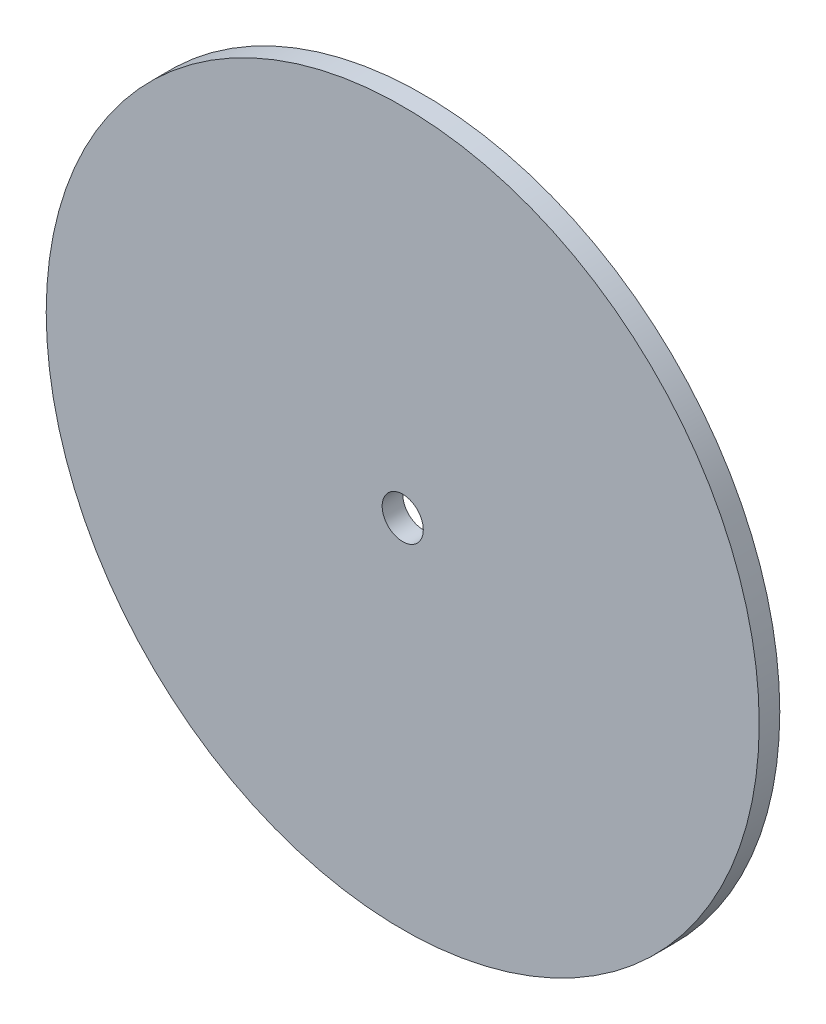
ISO-10303-21;
HEADER;
FILE_DESCRIPTION(('STEP AP214'),'2;1');
FILE_NAME('part.step','',(''),(''),'','','');
FILE_SCHEMA(('AUTOMOTIVE_DESIGN { 1 0 10303 214 1 1 1 1 }'));
ENDSEC;
DATA;
#1=APPLICATION_CONTEXT('core data for automotive mechanical design processes');
#2=APPLICATION_PROTOCOL_DEFINITION('international standard','automotive_design',2000,#1);
#3=PRODUCT_CONTEXT('',#1,'mechanical');
#4=PRODUCT('Part','Part','',(#3));
#5=PRODUCT_RELATED_PRODUCT_CATEGORY('part','',(#4));
#6=PRODUCT_DEFINITION_FORMATION('','',#4);
#7=PRODUCT_DEFINITION_CONTEXT('part definition',#1,'design');
#8=PRODUCT_DEFINITION('design','',#6,#7);
#9=PRODUCT_DEFINITION_SHAPE('','',#8);
#10=(LENGTH_UNIT() NAMED_UNIT(*) SI_UNIT(.MILLI.,.METRE.));
#11=(NAMED_UNIT(*) PLANE_ANGLE_UNIT() SI_UNIT($,.RADIAN.));
#12=(NAMED_UNIT(*) SI_UNIT($,.STERADIAN.) SOLID_ANGLE_UNIT());
#13=UNCERTAINTY_MEASURE_WITH_UNIT(LENGTH_MEASURE(1.E-05),#10,'distance_accuracy_value','');
#14=(GEOMETRIC_REPRESENTATION_CONTEXT(3) GLOBAL_UNCERTAINTY_ASSIGNED_CONTEXT((#13)) GLOBAL_UNIT_ASSIGNED_CONTEXT((#10,
#11,#12)) REPRESENTATION_CONTEXT('',''));
#15=CARTESIAN_POINT('',(0.,0.,0.));
#16=DIRECTION('',(0.,0.,1.));
#17=DIRECTION('',(1.,0.,0.));
#18=AXIS2_PLACEMENT_3D('',#15,#16,#17);
#19=CARTESIAN_POINT('',(0.,0.,3.));
#20=DIRECTION('',(0.,0.,-1.));
#21=DIRECTION('',(-1.,0.,0.));
#22=AXIS2_PLACEMENT_3D('',#19,#20,#21);
#23=CYLINDRICAL_SURFACE('',#22,3.);
#24=CARTESIAN_POINT('',(0.,0.,3.));
#25=DIRECTION('',(0.,0.,1.));
#26=DIRECTION('',(1.,0.,0.));
#27=AXIS2_PLACEMENT_3D('',#24,#25,#26);
#28=CIRCLE('',#27,3.);
#29=CARTESIAN_POINT('',(3.,0.,3.));
#30=VERTEX_POINT('',#29);
#31=EDGE_CURVE('E45',#30,#30,#28,.T.);
#32=ORIENTED_EDGE('',*,*,#31,.T.);
#33=EDGE_LOOP('',(#32));
#34=FACE_BOUND('',#33,.T.);
#35=CARTESIAN_POINT('',(0.,0.,0.));
#36=DIRECTION('',(0.,0.,1.));
#37=DIRECTION('',(1.,0.,0.));
#38=AXIS2_PLACEMENT_3D('',#35,#36,#37);
#39=CIRCLE('',#38,3.);
#40=CARTESIAN_POINT('',(3.,0.,0.));
#41=VERTEX_POINT('',#40);
#42=EDGE_CURVE('E51',#41,#41,#39,.T.);
#43=ORIENTED_EDGE('',*,*,#42,.F.);
#44=EDGE_LOOP('',(#43));
#45=FACE_BOUND('',#44,.T.);
#46=ADVANCED_FACE('F38',(#34,#45),#23,.F.);
#47=CARTESIAN_POINT('',(0.,0.,3.));
#48=DIRECTION('',(0.,0.,-1.));
#49=DIRECTION('',(-1.,0.,0.));
#50=AXIS2_PLACEMENT_3D('',#47,#48,#49);
#51=CYLINDRICAL_SURFACE('',#50,52.);
#52=CARTESIAN_POINT('',(0.,0.,3.));
#53=DIRECTION('',(0.,0.,1.));
#54=DIRECTION('',(1.,0.,0.));
#55=AXIS2_PLACEMENT_3D('',#52,#53,#54);
#56=CIRCLE('',#55,52.);
#57=CARTESIAN_POINT('',(52.,0.,3.));
#58=VERTEX_POINT('',#57);
#59=EDGE_CURVE('E10',#58,#58,#56,.T.);
#60=ORIENTED_EDGE('',*,*,#59,.F.);
#61=EDGE_LOOP('',(#60));
#62=FACE_BOUND('',#61,.T.);
#63=CARTESIAN_POINT('',(0.,0.,0.));
#64=DIRECTION('',(0.,0.,1.));
#65=DIRECTION('',(1.,0.,0.));
#66=AXIS2_PLACEMENT_3D('',#63,#64,#65);
#67=CIRCLE('',#66,52.);
#68=CARTESIAN_POINT('',(52.,0.,0.));
#69=VERTEX_POINT('',#68);
#70=EDGE_CURVE('E41',#69,#69,#67,.T.);
#71=ORIENTED_EDGE('',*,*,#70,.T.);
#72=EDGE_LOOP('',(#71));
#73=FACE_BOUND('',#72,.T.);
#74=ADVANCED_FACE('F58',(#62,#73),#51,.T.);
#75=CARTESIAN_POINT('',(0.,0.,3.));
#76=DIRECTION('',(0.,0.,1.));
#77=DIRECTION('',(1.,0.,0.));
#78=AXIS2_PLACEMENT_3D('',#75,#76,#77);
#79=PLANE('',#78);
#80=ORIENTED_EDGE('',*,*,#31,.F.);
#81=EDGE_LOOP('',(#80));
#82=FACE_BOUND('',#81,.T.);
#83=ORIENTED_EDGE('',*,*,#59,.T.);
#84=EDGE_LOOP('',(#83));
#85=FACE_BOUND('',#84,.T.);
#86=ADVANCED_FACE('F62',(#82,#85),#79,.T.);
#87=CARTESIAN_POINT('',(0.,0.,0.));
#88=DIRECTION('',(0.,0.,1.));
#89=DIRECTION('',(1.,0.,0.));
#90=AXIS2_PLACEMENT_3D('',#87,#88,#89);
#91=PLANE('',#90);
#92=ORIENTED_EDGE('',*,*,#42,.T.);
#93=EDGE_LOOP('',(#92));
#94=FACE_BOUND('',#93,.T.);
#95=ORIENTED_EDGE('',*,*,#70,.F.);
#96=EDGE_LOOP('',(#95));
#97=FACE_BOUND('',#96,.T.);
#98=ADVANCED_FACE('F60',(#94,#97),#91,.F.);
#99=CLOSED_SHELL('',(#46,#74,#86,#98));
#100=MANIFOLD_SOLID_BREP('B2',#99);
#101=ADVANCED_BREP_SHAPE_REPRESENTATION('',(#18,#100),#14);
#102=SHAPE_DEFINITION_REPRESENTATION(#9,#101);
ENDSEC;
END-ISO-10303-21;
